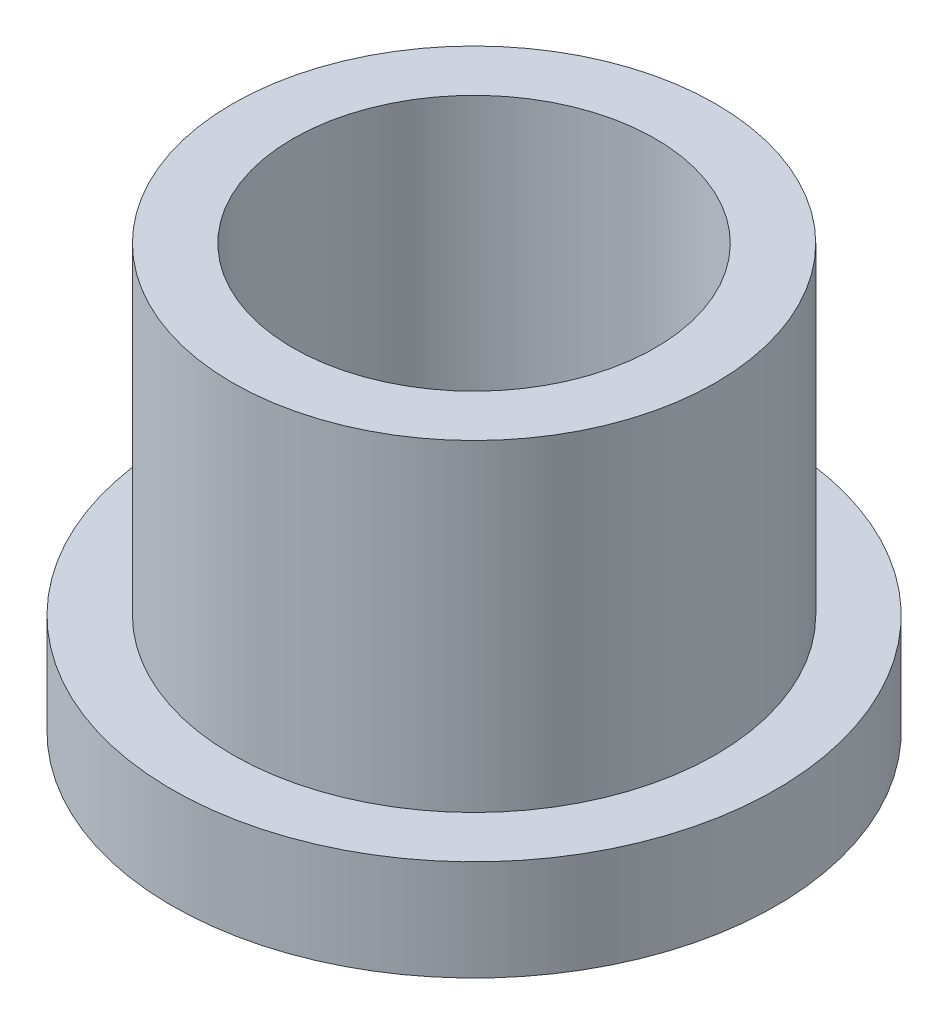
ISO-10303-21;
HEADER;
FILE_DESCRIPTION(('STEP AP214'),'2;1');
FILE_NAME('part.step','',(''),(''),'','','');
FILE_SCHEMA(('AUTOMOTIVE_DESIGN { 1 0 10303 214 1 1 1 1 }'));
ENDSEC;
DATA;
#1=APPLICATION_CONTEXT('core data for automotive mechanical design processes');
#2=APPLICATION_PROTOCOL_DEFINITION('international standard','automotive_design',2000,#1);
#3=PRODUCT_CONTEXT('',#1,'mechanical');
#4=PRODUCT('Part','Part','',(#3));
#5=PRODUCT_RELATED_PRODUCT_CATEGORY('part','',(#4));
#6=PRODUCT_DEFINITION_FORMATION('','',#4);
#7=PRODUCT_DEFINITION_CONTEXT('part definition',#1,'design');
#8=PRODUCT_DEFINITION('design','',#6,#7);
#9=PRODUCT_DEFINITION_SHAPE('','',#8);
#10=(LENGTH_UNIT() NAMED_UNIT(*) SI_UNIT(.MILLI.,.METRE.));
#11=(NAMED_UNIT(*) PLANE_ANGLE_UNIT() SI_UNIT($,.RADIAN.));
#12=(NAMED_UNIT(*) SI_UNIT($,.STERADIAN.) SOLID_ANGLE_UNIT());
#13=UNCERTAINTY_MEASURE_WITH_UNIT(LENGTH_MEASURE(1.E-05),#10,'distance_accuracy_value','');
#14=(GEOMETRIC_REPRESENTATION_CONTEXT(3) GLOBAL_UNCERTAINTY_ASSIGNED_CONTEXT((#13)) GLOBAL_UNIT_ASSIGNED_CONTEXT((#10,
#11,#12)) REPRESENTATION_CONTEXT('',''));
#15=CARTESIAN_POINT('',(0.,0.,0.));
#16=DIRECTION('',(0.,0.,1.));
#17=DIRECTION('',(1.,0.,0.));
#18=AXIS2_PLACEMENT_3D('',#15,#16,#17);
#19=CARTESIAN_POINT('',(15.,0.,0.));
#20=DIRECTION('',(0.,-1.,0.));
#21=DIRECTION('',(1.,0.,0.));
#22=AXIS2_PLACEMENT_3D('',#19,#20,#21);
#23=PLANE('',#22);
#24=CARTESIAN_POINT('',(15.,0.,0.));
#25=DIRECTION('',(0.,1.,0.));
#26=DIRECTION('',(-1.,0.,0.));
#27=AXIS2_PLACEMENT_3D('',#24,#25,#26);
#28=CIRCLE('',#27,9.00000000000001);
#29=CARTESIAN_POINT('',(5.99999999999999,0.,0.));
#30=VERTEX_POINT('',#29);
#31=EDGE_CURVE('E59',#30,#30,#28,.T.);
#32=ORIENTED_EDGE('',*,*,#31,.T.);
#33=EDGE_LOOP('',(#32));
#34=FACE_BOUND('',#33,.T.);
#35=CARTESIAN_POINT('',(15.,0.,0.));
#36=DIRECTION('',(0.,1.,0.));
#37=DIRECTION('',(-1.,0.,0.));
#38=AXIS2_PLACEMENT_3D('',#35,#36,#37);
#39=CIRCLE('',#38,15.);
#40=CARTESIAN_POINT('',(0.,0.,0.));
#41=VERTEX_POINT('',#40);
#42=EDGE_CURVE('E10',#41,#41,#39,.T.);
#43=ORIENTED_EDGE('',*,*,#42,.F.);
#44=EDGE_LOOP('',(#43));
#45=FACE_BOUND('',#44,.T.);
#46=ADVANCED_FACE('F40',(#34,#45),#23,.T.);
#47=CARTESIAN_POINT('',(15.,21.,0.));
#48=DIRECTION('',(0.,1.,0.));
#49=DIRECTION('',(-1.,0.,0.));
#50=AXIS2_PLACEMENT_3D('',#47,#48,#49);
#51=CYLINDRICAL_SURFACE('',#50,15.);
#52=ORIENTED_EDGE('',*,*,#42,.T.);
#53=EDGE_LOOP('',(#52));
#54=FACE_BOUND('',#53,.T.);
#55=CARTESIAN_POINT('',(15.,5.,0.));
#56=DIRECTION('',(0.,1.,0.));
#57=DIRECTION('',(-1.,0.,0.));
#58=AXIS2_PLACEMENT_3D('',#55,#56,#57);
#59=CIRCLE('',#58,15.);
#60=CARTESIAN_POINT('',(0.,5.,0.));
#61=VERTEX_POINT('',#60);
#62=EDGE_CURVE('E46',#61,#61,#59,.T.);
#63=ORIENTED_EDGE('',*,*,#62,.F.);
#64=EDGE_LOOP('',(#63));
#65=FACE_BOUND('',#64,.T.);
#66=ADVANCED_FACE('F88',(#54,#65),#51,.T.);
#67=CARTESIAN_POINT('',(0.,5.,0.));
#68=DIRECTION('',(0.,1.,0.));
#69=DIRECTION('',(-1.,0.,0.));
#70=AXIS2_PLACEMENT_3D('',#67,#68,#69);
#71=PLANE('',#70);
#72=ORIENTED_EDGE('',*,*,#62,.T.);
#73=EDGE_LOOP('',(#72));
#74=FACE_BOUND('',#73,.T.);
#75=CARTESIAN_POINT('',(15.,5.,0.));
#76=DIRECTION('',(0.,1.,0.));
#77=DIRECTION('',(-1.,0.,0.));
#78=AXIS2_PLACEMENT_3D('',#75,#76,#77);
#79=CIRCLE('',#78,12.);
#80=CARTESIAN_POINT('',(3.,5.,0.));
#81=VERTEX_POINT('',#80);
#82=EDGE_CURVE('E50',#81,#81,#79,.T.);
#83=ORIENTED_EDGE('',*,*,#82,.F.);
#84=EDGE_LOOP('',(#83));
#85=FACE_BOUND('',#84,.T.);
#86=ADVANCED_FACE('F82',(#74,#85),#71,.T.);
#87=CARTESIAN_POINT('',(15.,21.,0.));
#88=DIRECTION('',(0.,1.,0.));
#89=DIRECTION('',(-1.,0.,0.));
#90=AXIS2_PLACEMENT_3D('',#87,#88,#89);
#91=CYLINDRICAL_SURFACE('',#90,12.);
#92=ORIENTED_EDGE('',*,*,#82,.T.);
#93=EDGE_LOOP('',(#92));
#94=FACE_BOUND('',#93,.T.);
#95=CARTESIAN_POINT('',(15.,21.,0.));
#96=DIRECTION('',(0.,1.,0.));
#97=DIRECTION('',(-1.,0.,0.));
#98=AXIS2_PLACEMENT_3D('',#95,#96,#97);
#99=CIRCLE('',#98,12.);
#100=CARTESIAN_POINT('',(3.,21.,0.));
#101=VERTEX_POINT('',#100);
#102=EDGE_CURVE('E54',#101,#101,#99,.T.);
#103=ORIENTED_EDGE('',*,*,#102,.F.);
#104=EDGE_LOOP('',(#103));
#105=FACE_BOUND('',#104,.T.);
#106=ADVANCED_FACE('F77',(#94,#105),#91,.T.);
#107=CARTESIAN_POINT('',(3.,21.,0.));
#108=DIRECTION('',(0.,1.,0.));
#109=DIRECTION('',(-1.,0.,0.));
#110=AXIS2_PLACEMENT_3D('',#107,#108,#109);
#111=PLANE('',#110);
#112=CARTESIAN_POINT('',(15.,21.,0.));
#113=DIRECTION('',(0.,1.,0.));
#114=DIRECTION('',(-1.,0.,0.));
#115=AXIS2_PLACEMENT_3D('',#112,#113,#114);
#116=CIRCLE('',#115,9.00000000000001);
#117=CARTESIAN_POINT('',(5.99999999999999,21.,0.));
#118=VERTEX_POINT('',#117);
#119=EDGE_CURVE('E60',#118,#118,#116,.T.);
#120=ORIENTED_EDGE('',*,*,#119,.F.);
#121=EDGE_LOOP('',(#120));
#122=FACE_BOUND('',#121,.T.);
#123=ORIENTED_EDGE('',*,*,#102,.T.);
#124=EDGE_LOOP('',(#123));
#125=FACE_BOUND('',#124,.T.);
#126=ADVANCED_FACE('F71',(#122,#125),#111,.T.);
#127=CARTESIAN_POINT('',(15.,0.,0.));
#128=DIRECTION('',(0.,1.,0.));
#129=DIRECTION('',(-1.,0.,0.));
#130=AXIS2_PLACEMENT_3D('',#127,#128,#129);
#131=CYLINDRICAL_SURFACE('',#130,9.00000000000001);
#132=ORIENTED_EDGE('',*,*,#31,.F.);
#133=EDGE_LOOP('',(#132));
#134=FACE_BOUND('',#133,.T.);
#135=ORIENTED_EDGE('',*,*,#119,.T.);
#136=EDGE_LOOP('',(#135));
#137=FACE_BOUND('',#136,.T.);
#138=ADVANCED_FACE('F68',(#134,#137),#131,.F.);
#139=CLOSED_SHELL('',(#46,#66,#86,#106,#126,#138));
#140=MANIFOLD_SOLID_BREP('B2',#139);
#141=ADVANCED_BREP_SHAPE_REPRESENTATION('',(#18,#140),#14);
#142=SHAPE_DEFINITION_REPRESENTATION(#9,#141);
ENDSEC;
END-ISO-10303-21;
